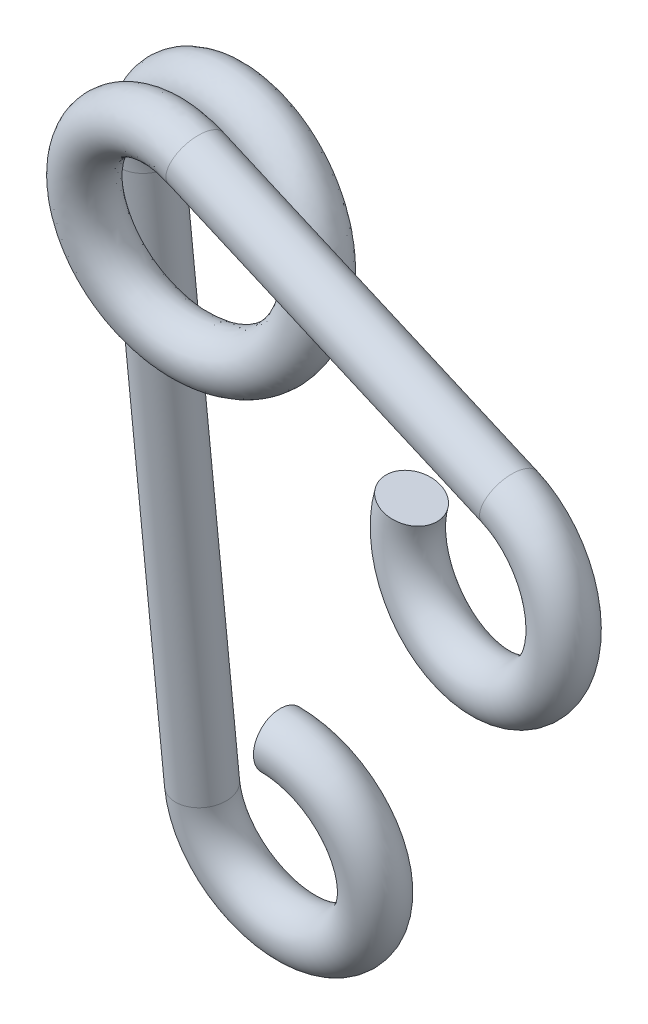
ISO-10303-21;
HEADER;
FILE_DESCRIPTION(('STEP AP214'),'2;1');
FILE_NAME('part.step','',(''),(''),'','','');
FILE_SCHEMA(('AUTOMOTIVE_DESIGN { 1 0 10303 214 1 1 1 1 }'));
ENDSEC;
DATA;
#1=APPLICATION_CONTEXT('core data for automotive mechanical design processes');
#2=APPLICATION_PROTOCOL_DEFINITION('international standard','automotive_design',2000,#1);
#3=PRODUCT_CONTEXT('',#1,'mechanical');
#4=PRODUCT('Part','Part','',(#3));
#5=PRODUCT_RELATED_PRODUCT_CATEGORY('part','',(#4));
#6=PRODUCT_DEFINITION_FORMATION('','',#4);
#7=PRODUCT_DEFINITION_CONTEXT('part definition',#1,'design');
#8=PRODUCT_DEFINITION('design','',#6,#7);
#9=PRODUCT_DEFINITION_SHAPE('','',#8);
#10=(LENGTH_UNIT() NAMED_UNIT(*) SI_UNIT(.MILLI.,.METRE.));
#11=(NAMED_UNIT(*) PLANE_ANGLE_UNIT() SI_UNIT($,.RADIAN.));
#12=(NAMED_UNIT(*) SI_UNIT($,.STERADIAN.) SOLID_ANGLE_UNIT());
#13=UNCERTAINTY_MEASURE_WITH_UNIT(LENGTH_MEASURE(1.E-05),#10,'distance_accuracy_value','');
#14=(GEOMETRIC_REPRESENTATION_CONTEXT(3) GLOBAL_UNCERTAINTY_ASSIGNED_CONTEXT((#13)) GLOBAL_UNIT_ASSIGNED_CONTEXT((#10,
#11,#12)) REPRESENTATION_CONTEXT('',''));
#15=CARTESIAN_POINT('',(0.,0.,0.));
#16=DIRECTION('',(0.,0.,1.));
#17=DIRECTION('',(1.,0.,0.));
#18=AXIS2_PLACEMENT_3D('',#15,#16,#17);
#19=CARTESIAN_POINT('',(-2.925,-0.0743899060389696,0.768407536323998));
#20=CARTESIAN_POINT('',(-2.94917074567298,0.876000205442281,0.857368225275111));
#21=CARTESIAN_POINT('',(-2.41009999823585,1.65908916476,0.946328914226225));
#22=CARTESIAN_POINT('',(-1.87102925079872,2.44217812407772,1.03528960317734));
#23=CARTESIAN_POINT('',(-0.974623713431668,2.75885256498733,1.12425029212845));
#24=CARTESIAN_POINT('',(-0.0782181760646109,3.07552700589693,1.21321098107957));
#25=CARTESIAN_POINT('',(0.833125703661775,2.80482805533932,1.30217167003068));
#26=CARTESIAN_POINT('',(1.74446958338816,2.53412910478171,1.39113235898179));
#27=CARTESIAN_POINT('',(2.32264941885759,1.77945456115097,1.4800930479329));
#28=CARTESIAN_POINT('',(2.90082925432702,1.02478001752022,1.56905373688402));
#29=CARTESIAN_POINT('',(2.925,0.07438990603897,1.65801442583513));
#30=CARTESIAN_POINT('',(2.94917074567298,-0.876000205442281,1.74697511478624));
#31=CARTESIAN_POINT('',(2.41009999823585,-1.65908916476,1.83593580373736));
#32=CARTESIAN_POINT('',(1.87102925079873,-2.44217812407772,1.92489649268847));
#33=CARTESIAN_POINT('',(0.974623713431668,-2.75885256498733,2.01385718163958));
#34=CARTESIAN_POINT('',(0.0782181760646113,-3.07552700589693,2.1028178705907));
#35=CARTESIAN_POINT('',(-0.833125703661775,-2.80482805533932,2.19177855954181));
#36=CARTESIAN_POINT('',(-1.74446958338816,-2.53412910478171,2.28073924849292));
#37=CARTESIAN_POINT('',(-2.32264941885759,-1.77945456115097,2.36969993744404));
#38=CARTESIAN_POINT('',(-2.90082925432702,-1.02478001752022,2.45866062639515));
#39=CARTESIAN_POINT('',(-2.925,-0.0743899060389696,2.54762131534626));
#40=CARTESIAN_POINT('',(-2.94917074567298,0.876000205442281,2.63658200429738));
#41=CARTESIAN_POINT('',(-2.41009999823585,1.65908916476,2.72554269324849));
#42=CARTESIAN_POINT('',(-1.87102925079872,2.44217812407772,2.8145033821996));
#43=CARTESIAN_POINT('',(-0.974623713431668,2.75885256498733,2.90346407115072));
#44=CARTESIAN_POINT('',(-0.126338533199783,3.05852745986901,2.98764922052195));
#45=CARTESIAN_POINT('',(0.743771935802185,2.82983430003129,3.07265935596611));
#46=CARTESIAN_POINT('',(-1.381,-0.0743899060389578,0.768407536323999));
#47=CARTESIAN_POINT('',(-1.40517074567297,0.374324194458686,0.857368225275113));
#48=CARTESIAN_POINT('',(-1.16097775892093,0.751548735220433,0.946328914226226));
#49=CARTESIAN_POINT('',(-0.916784772168877,1.12877327598218,1.03528960317734));
#50=CARTESIAN_POINT('',(-0.497501474116738,1.29042130382761,1.12425029212845));
#51=CARTESIAN_POINT('',(-0.0782181760645984,1.45206933167305,1.21321098107957));
#52=CARTESIAN_POINT('',(0.356003464346867,1.3363967941796,1.30217167003068));
#53=CARTESIAN_POINT('',(0.790225104758333,1.22072425668615,1.39113235898179));
#54=CARTESIAN_POINT('',(1.07352717954268,0.871914131611378,1.48009304793291));
#55=CARTESIAN_POINT('',(1.35682925432703,0.523104006536602,1.56905373688402));
#56=CARTESIAN_POINT('',(1.381,0.074389906038958,1.65801442583513));
#57=CARTESIAN_POINT('',(1.40517074567297,-0.374324194458686,1.74697511478625));
#58=CARTESIAN_POINT('',(1.16097775892093,-0.751548735220433,1.83593580373736));
#59=CARTESIAN_POINT('',(0.916784772168877,-1.12877327598218,1.92489649268847));
#60=CARTESIAN_POINT('',(0.497501474116738,-1.29042130382761,2.01385718163959));
#61=CARTESIAN_POINT('',(0.0782181760645986,-1.45206933167305,2.1028178705907));
#62=CARTESIAN_POINT('',(-0.356003464346867,-1.3363967941796,2.19177855954181));
#63=CARTESIAN_POINT('',(-0.790225104758333,-1.22072425668616,2.28073924849293));
#64=CARTESIAN_POINT('',(-1.07352717954268,-0.871914131611378,2.36969993744404));
#65=CARTESIAN_POINT('',(-1.35682925432703,-0.523104006536602,2.45866062639515));
#66=CARTESIAN_POINT('',(-1.381,-0.0743899060389578,2.54762131534627));
#67=CARTESIAN_POINT('',(-1.40517074567297,0.374324194458686,2.63658200429738));
#68=CARTESIAN_POINT('',(-1.16097775892093,0.751548735220433,2.72554269324849));
#69=CARTESIAN_POINT('',(-0.916784772168877,1.12877327598218,2.81450338219961));
#70=CARTESIAN_POINT('',(-0.497501474116738,1.29042130382761,2.90346407115072));
#71=CARTESIAN_POINT('',(-0.100725915254099,1.44339182968777,2.98764922052195));
#72=CARTESIAN_POINT('',(0.313450290357979,1.34701290773139,3.07265935596612));
#73=CARTESIAN_POINT('',(-1.381,0.0743899060389405,-0.768407536323997));
#74=CARTESIAN_POINT('',(-1.35682925432703,0.523104006536584,-0.679446847372884));
#75=CARTESIAN_POINT('',(-1.07352717954269,0.871914131611364,-0.59048615842177));
#76=CARTESIAN_POINT('',(-0.790225104758348,1.22072425668614,-0.501525469470657));
#77=CARTESIAN_POINT('',(-0.356003464346884,1.3363967941796,-0.412564780519544));
#78=CARTESIAN_POINT('',(0.0782181760645801,1.45206933167305,-0.32360409156843));
#79=CARTESIAN_POINT('',(0.497501474116721,1.29042130382762,-0.234643402617317));
#80=CARTESIAN_POINT('',(0.916784772168862,1.12877327598219,-0.145682713666204));
#81=CARTESIAN_POINT('',(1.16097775892091,0.751548735220447,-0.0567220247150904));
#82=CARTESIAN_POINT('',(1.40517074567297,0.374324194458703,0.0322386642360229));
#83=CARTESIAN_POINT('',(1.381,-0.0743899060389404,0.121199353187136));
#84=CARTESIAN_POINT('',(1.35682925432703,-0.523104006536584,0.21016004213825));
#85=CARTESIAN_POINT('',(1.07352717954269,-0.871914131611364,0.299120731089363));
#86=CARTESIAN_POINT('',(0.790225104758348,-1.22072425668614,0.388081420040476));
#87=CARTESIAN_POINT('',(0.356003464346884,-1.3363967941796,0.47704210899159));
#88=CARTESIAN_POINT('',(-0.0782181760645799,-1.45206933167305,0.566002797942703));
#89=CARTESIAN_POINT('',(-0.497501474116721,-1.29042130382762,0.654963486893816));
#90=CARTESIAN_POINT('',(-0.916784772168862,-1.12877327598219,0.74392417584493));
#91=CARTESIAN_POINT('',(-1.16097775892091,-0.751548735220448,0.832884864796043));
#92=CARTESIAN_POINT('',(-1.40517074567297,-0.374324194458704,0.921845553747156));
#93=CARTESIAN_POINT('',(-1.381,0.0743899060389405,1.01080624269827));
#94=CARTESIAN_POINT('',(-1.35682925432703,0.523104006536584,1.09976693164938));
#95=CARTESIAN_POINT('',(-1.07352717954269,0.871914131611364,1.1887276206005));
#96=CARTESIAN_POINT('',(-0.790225104758348,1.22072425668614,1.27768830955161));
#97=CARTESIAN_POINT('',(-0.356003464346884,1.3363967941796,1.36664899850272));
#98=CARTESIAN_POINT('',(0.0549085248616288,1.44585986108983,1.45083414787396));
#99=CARTESIAN_POINT('',(0.456334932904265,1.30554712175844,1.53584428331812));
#100=CARTESIAN_POINT('',(-2.925,0.0743899060389288,-0.768407536323998));
#101=CARTESIAN_POINT('',(-2.90082925432704,1.02478001752018,-0.679446847372885));
#102=CARTESIAN_POINT('',(-2.32264941885762,1.77945456115093,-0.590486158421771));
#103=CARTESIAN_POINT('',(-1.7444695833882,2.53412910478169,-0.501525469470658));
#104=CARTESIAN_POINT('',(-0.833125703661814,2.80482805533931,-0.412564780519545));
#105=CARTESIAN_POINT('',(0.0782181760645676,3.07552700589693,-0.323604091568432));
#106=CARTESIAN_POINT('',(0.974623713431629,2.75885256498734,-0.234643402617318));
#107=CARTESIAN_POINT('',(1.87102925079869,2.44217812407775,-0.145682713666205));
#108=CARTESIAN_POINT('',(2.41009999823583,1.65908916476004,-0.0567220247150916));
#109=CARTESIAN_POINT('',(2.94917074567296,0.876000205442323,0.0322386642360217));
#110=CARTESIAN_POINT('',(2.925,-0.0743899060389284,0.121199353187135));
#111=CARTESIAN_POINT('',(2.90082925432704,-1.02478001752018,0.210160042138248));
#112=CARTESIAN_POINT('',(2.32264941885762,-1.77945456115093,0.299120731089362));
#113=CARTESIAN_POINT('',(1.7444695833882,-2.53412910478169,0.388081420040475));
#114=CARTESIAN_POINT('',(0.833125703661814,-2.80482805533931,0.477042108991588));
#115=CARTESIAN_POINT('',(-0.0782181760645672,-3.07552700589693,0.566002797942702));
#116=CARTESIAN_POINT('',(-0.974623713431628,-2.75885256498734,0.654963486893815));
#117=CARTESIAN_POINT('',(-1.87102925079869,-2.44217812407775,0.743924175844928));
#118=CARTESIAN_POINT('',(-2.41009999823583,-1.65908916476004,0.832884864796042));
#119=CARTESIAN_POINT('',(-2.94917074567296,-0.876000205442323,0.921845553747155));
#120=CARTESIAN_POINT('',(-2.925,0.0743899060389288,1.01080624269827));
#121=CARTESIAN_POINT('',(-2.90082925432704,1.02478001752018,1.09976693164938));
#122=CARTESIAN_POINT('',(-2.32264941885762,1.77945456115093,1.18872762060049));
#123=CARTESIAN_POINT('',(-1.7444695833882,2.53412910478169,1.27768830955161));
#124=CARTESIAN_POINT('',(-0.833125703661814,2.80482805533931,1.36664899850272));
#125=CARTESIAN_POINT('',(0.0292959069159445,3.06099549127107,1.45083414787396));
#126=CARTESIAN_POINT('',(0.886656578348471,2.78836851405833,1.53584428331812));
#127=CARTESIAN_POINT('',(-4.469,0.074389906038917,-0.768407536324));
#128=CARTESIAN_POINT('',(-4.44482925432704,1.52645602850378,-0.679446847372886));
#129=CARTESIAN_POINT('',(-3.57177165817254,2.6869949906905,-0.590486158421773));
#130=CARTESIAN_POINT('',(-2.69871406201804,3.84753395287723,-0.50152546947066));
#131=CARTESIAN_POINT('',(-1.31024794297674,4.27325931649902,-0.412564780519546));
#132=CARTESIAN_POINT('',(0.0782181760645551,4.69898468012082,-0.323604091568433));
#133=CARTESIAN_POINT('',(1.45174595274654,4.22728382614706,-0.23464340261732));
#134=CARTESIAN_POINT('',(2.82527372942852,3.75558297217331,-0.145682713666206));
#135=CARTESIAN_POINT('',(3.65922223755074,2.56662959429962,-0.056722024715093));
#136=CARTESIAN_POINT('',(4.49317074567296,1.37767621642594,0.0322386642360203));
#137=CARTESIAN_POINT('',(4.469,-0.0743899060389165,0.121199353187134));
#138=CARTESIAN_POINT('',(4.44482925432704,-1.52645602850378,0.210160042138247));
#139=CARTESIAN_POINT('',(3.57177165817254,-2.6869949906905,0.29912073108936));
#140=CARTESIAN_POINT('',(2.69871406201804,-3.84753395287723,0.388081420040474));
#141=CARTESIAN_POINT('',(1.31024794297674,-4.27325931649902,0.477042108991587));
#142=CARTESIAN_POINT('',(-0.0782181760645545,-4.69898468012082,0.5660027979427));
#143=CARTESIAN_POINT('',(-1.45174595274654,-4.22728382614706,0.654963486893814));
#144=CARTESIAN_POINT('',(-2.82527372942852,-3.75558297217331,0.743924175844927));
#145=CARTESIAN_POINT('',(-3.65922223755074,-2.56662959429962,0.83288486479604));
#146=CARTESIAN_POINT('',(-4.49317074567296,-1.37767621642594,0.921845553747153));
#147=CARTESIAN_POINT('',(-4.469,0.074389906038917,1.01080624269827));
#148=CARTESIAN_POINT('',(-4.44482925432704,1.52645602850378,1.09976693164938));
#149=CARTESIAN_POINT('',(-3.57177165817254,2.6869949906905,1.18872762060049));
#150=CARTESIAN_POINT('',(-2.69871406201804,3.84753395287723,1.27768830955161));
#151=CARTESIAN_POINT('',(-1.31024794297674,4.27325931649902,1.36664899850272));
#152=CARTESIAN_POINT('',(0.00368328897026012,4.67613112145232,1.45083414787396));
#153=CARTESIAN_POINT('',(1.31697822379268,4.27118990635822,1.53584428331812));
#154=CARTESIAN_POINT('',(-4.469,-0.0743899060389814,0.768407536323997));
#155=CARTESIAN_POINT('',(-4.49317074567298,1.37767621642588,0.85736822527511));
#156=CARTESIAN_POINT('',(-3.65922223755078,2.56662959429957,0.946328914226224));
#157=CARTESIAN_POINT('',(-2.82527372942857,3.75558297217327,1.03528960317734));
#158=CARTESIAN_POINT('',(-1.4517459527466,4.22728382614704,1.12425029212845));
#159=CARTESIAN_POINT('',(-0.0782181760646234,4.69898468012082,1.21321098107956));
#160=CARTESIAN_POINT('',(1.31024794297668,4.27325931649904,1.30217167003068));
#161=CARTESIAN_POINT('',(2.69871406201799,3.84753395287727,1.39113235898179));
#162=CARTESIAN_POINT('',(3.5717716581725,2.68699499069056,1.4800930479329));
#163=CARTESIAN_POINT('',(4.44482925432702,1.52645602850384,1.56905373688402));
#164=CARTESIAN_POINT('',(4.469,0.0743899060389819,1.65801442583513));
#165=CARTESIAN_POINT('',(4.49317074567298,-1.37767621642588,1.74697511478624));
#166=CARTESIAN_POINT('',(3.65922223755078,-2.56662959429957,1.83593580373736));
#167=CARTESIAN_POINT('',(2.82527372942857,-3.75558297217327,1.92489649268847));
#168=CARTESIAN_POINT('',(1.4517459527466,-4.22728382614704,2.01385718163958));
#169=CARTESIAN_POINT('',(0.078218176064624,-4.69898468012082,2.1028178705907));
#170=CARTESIAN_POINT('',(-1.31024794297668,-4.27325931649904,2.19177855954181));
#171=CARTESIAN_POINT('',(-2.69871406201799,-3.84753395287727,2.28073924849292));
#172=CARTESIAN_POINT('',(-3.5717716581725,-2.68699499069056,2.36969993744404));
#173=CARTESIAN_POINT('',(-4.44482925432702,-1.52645602850384,2.45866062639515));
#174=CARTESIAN_POINT('',(-4.469,-0.0743899060389814,2.54762131534626));
#175=CARTESIAN_POINT('',(-4.49317074567298,1.37767621642588,2.63658200429738));
#176=CARTESIAN_POINT('',(-3.65922223755078,2.56662959429957,2.72554269324849));
#177=CARTESIAN_POINT('',(-2.82527372942857,3.75558297217327,2.8145033821996));
#178=CARTESIAN_POINT('',(-1.4517459527466,4.22728382614704,2.90346407115072));
#179=CARTESIAN_POINT('',(-0.151951151145468,4.67366309005026,2.98764922052195));
#180=CARTESIAN_POINT('',(1.17409358124639,4.31265569233118,3.07265935596611));
#181=CARTESIAN_POINT('',(-2.925,-0.0743899060389696,0.768407536323998));
#182=CARTESIAN_POINT('',(-2.94917074567298,0.876000205442281,0.857368225275111));
#183=CARTESIAN_POINT('',(-2.41009999823585,1.65908916476,0.946328914226225));
#184=CARTESIAN_POINT('',(-1.87102925079872,2.44217812407772,1.03528960317734));
#185=CARTESIAN_POINT('',(-0.974623713431668,2.75885256498733,1.12425029212845));
#186=CARTESIAN_POINT('',(-0.0782181760646109,3.07552700589693,1.21321098107957));
#187=CARTESIAN_POINT('',(0.833125703661775,2.80482805533932,1.30217167003068));
#188=CARTESIAN_POINT('',(1.74446958338816,2.53412910478171,1.39113235898179));
#189=CARTESIAN_POINT('',(2.32264941885759,1.77945456115097,1.4800930479329));
#190=CARTESIAN_POINT('',(2.90082925432702,1.02478001752022,1.56905373688402));
#191=CARTESIAN_POINT('',(2.925,0.07438990603897,1.65801442583513));
#192=CARTESIAN_POINT('',(2.94917074567298,-0.876000205442281,1.74697511478624));
#193=CARTESIAN_POINT('',(2.41009999823585,-1.65908916476,1.83593580373736));
#194=CARTESIAN_POINT('',(1.87102925079873,-2.44217812407772,1.92489649268847));
#195=CARTESIAN_POINT('',(0.974623713431668,-2.75885256498733,2.01385718163958));
#196=CARTESIAN_POINT('',(0.0782181760646113,-3.07552700589693,2.1028178705907));
#197=CARTESIAN_POINT('',(-0.833125703661775,-2.80482805533932,2.19177855954181));
#198=CARTESIAN_POINT('',(-1.74446958338816,-2.53412910478171,2.28073924849292));
#199=CARTESIAN_POINT('',(-2.32264941885759,-1.77945456115097,2.36969993744404));
#200=CARTESIAN_POINT('',(-2.90082925432702,-1.02478001752022,2.45866062639515));
#201=CARTESIAN_POINT('',(-2.925,-0.0743899060389696,2.54762131534626));
#202=CARTESIAN_POINT('',(-2.94917074567298,0.876000205442281,2.63658200429738));
#203=CARTESIAN_POINT('',(-2.41009999823585,1.65908916476,2.72554269324849));
#204=CARTESIAN_POINT('',(-1.87102925079872,2.44217812407772,2.8145033821996));
#205=CARTESIAN_POINT('',(-0.974623713431668,2.75885256498733,2.90346407115072));
#206=CARTESIAN_POINT('',(-0.126338533199783,3.05852745986901,2.98764922052195));
#207=CARTESIAN_POINT('',(0.743771935802185,2.82983430003129,3.07265935596611));
#208=(BOUNDED_SURFACE() B_SPLINE_SURFACE(3,2,((#19,#20,#21,#22,#23,#24,#25,#26,#27,#28,#29,#30,
#31,#32,#33,#34,#35,#36,#37,#38,#39,#40,#41,#42,#43,#44,#45),(#46,#47,#48,#49,#50,#51,#52,#53,
#54,#55,#56,#57,#58,#59,#60,#61,#62,#63,#64,#65,#66,#67,#68,#69,#70,#71,#72),(#73,#74,#75,#76,
#77,#78,#79,#80,#81,#82,#83,#84,#85,#86,#87,#88,#89,#90,#91,#92,#93,#94,#95,#96,#97,#98,#99),
(#100,#101,#102,#103,#104,#105,#106,#107,#108,#109,#110,#111,#112,#113,#114,#115,#116,#117,#118,
#119,#120,#121,#122,#123,#124,#125,#126),(#127,#128,#129,#130,#131,#132,#133,#134,#135,#136,
#137,#138,#139,#140,#141,#142,#143,#144,#145,#146,#147,#148,#149,#150,#151,#152,#153),(#154,
#155,#156,#157,#158,#159,#160,#161,#162,#163,#164,#165,#166,#167,#168,#169,#170,#171,#172,#173,
#174,#175,#176,#177,#178,#179,#180),(#181,#182,#183,#184,#185,#186,#187,#188,#189,#190,#191,
#192,#193,#194,#195,#196,#197,#198,#199,#200,#201,#202,#203,#204,#205,#206,#207)),.UNSPECIFIED.,
.T.,.F.,.F.) B_SPLINE_SURFACE_WITH_KNOTS((4,3,4),(3,2,2,2,2,2,2,2,2,2,2,2,2,3),(0.,0.5,1.),(0.,
0.05,0.1,0.15,0.2,0.25,0.3,0.35,0.4,0.45,0.5,0.55,0.6,0.647440570392035),
.UNSPECIFIED.) GEOMETRIC_REPRESENTATION_ITEM() RATIONAL_B_SPLINE_SURFACE(((1.,0.951056516295154,
1.,0.951056516295154,1.,0.951056516295154,1.,0.951056516295154,1.,0.951056516295154,1.,
0.951056516295154,1.,0.951056516295154,1.,0.951056516295154,1.,0.951056516295154,1.,
0.951056516295154,1.,0.951056516295154,1.,0.951056516295154,1.,0.953561864321377,
0.995245794424217),(0.333333333333333,0.317018838765051,0.333333333333333,0.317018838765051,
0.333333333333333,0.317018838765051,0.333333333333333,0.317018838765051,0.333333333333333,
0.317018838765051,0.333333333333333,0.317018838765051,0.333333333333333,0.317018838765051,
0.333333333333333,0.317018838765051,0.333333333333333,0.317018838765051,0.333333333333333,
0.317018838765051,0.333333333333333,0.317018838765051,0.333333333333333,0.317018838765051,
0.333333333333333,0.317853954773792,0.331748598141406),(0.333333333333333,0.317018838765051,
0.333333333333333,0.317018838765051,0.333333333333333,0.317018838765051,0.333333333333333,
0.317018838765051,0.333333333333333,0.317018838765051,0.333333333333333,0.317018838765051,
0.333333333333333,0.317018838765051,0.333333333333333,0.317018838765051,0.333333333333333,
0.317018838765051,0.333333333333333,0.317018838765051,0.333333333333333,0.317018838765051,
0.333333333333333,0.317018838765051,0.333333333333333,0.317853954773792,0.331748598141406),(1.,
0.951056516295154,1.,0.951056516295154,1.,0.951056516295154,1.,0.951056516295154,1.,
0.951056516295154,1.,0.951056516295154,1.,0.951056516295154,1.,0.951056516295154,1.,
0.951056516295154,1.,0.951056516295154,1.,0.951056516295154,1.,0.951056516295154,1.,
0.953561864321377,0.995245794424217),(0.333333333333333,0.317018838765051,0.333333333333333,
0.317018838765051,0.333333333333333,0.317018838765051,0.333333333333333,0.317018838765051,
0.333333333333333,0.317018838765051,0.333333333333333,0.317018838765051,0.333333333333333,
0.317018838765051,0.333333333333333,0.317018838765051,0.333333333333333,0.317018838765051,
0.333333333333333,0.317018838765051,0.333333333333333,0.317018838765051,0.333333333333333,
0.317018838765051,0.333333333333333,0.317853954773792,0.331748598141406),(0.333333333333333,
0.317018838765051,0.333333333333333,0.317018838765051,0.333333333333333,0.317018838765051,
0.333333333333333,0.317018838765051,0.333333333333333,0.317018838765051,0.333333333333333,
0.317018838765051,0.333333333333333,0.317018838765051,0.333333333333333,0.317018838765051,
0.333333333333333,0.317018838765051,0.333333333333333,0.317018838765051,0.333333333333333,
0.317018838765051,0.333333333333333,0.317018838765051,0.333333333333333,0.317853954773792,
0.331748598141406),(1.,0.951056516295154,1.,0.951056516295154,1.,0.951056516295154,1.,
0.951056516295154,1.,0.951056516295154,1.,0.951056516295154,1.,0.951056516295154,1.,
0.951056516295154,1.,0.951056516295154,1.,0.951056516295154,1.,0.951056516295154,1.,
0.951056516295154,1.,0.953561864321377,0.995245794424217))) REPRESENTATION_ITEM('') SURFACE());
#209=CARTESIAN_POINT('',(-2.925,0.,0.));
#210=DIRECTION('',(0.,-0.995346549642485,-0.0963599819157372));
#211=DIRECTION('',(0.,0.0963599819157372,-0.995346549642485));
#212=AXIS2_PLACEMENT_3D('',#209,#210,#211);
#213=CIRCLE('',#212,0.772);
#214=CARTESIAN_POINT('',(-2.925,0.0743899060389267,-0.768407536323999));
#215=VERTEX_POINT('',#214);
#216=EDGE_CURVE('E49',#215,#215,#213,.T.);
#217=CARTESIAN_POINT('',(0.743771935802185,2.82983430003129,3.07265935596611));
#218=CARTESIAN_POINT('',(1.17409358124639,4.31265569233118,3.07265935596611));
#219=CARTESIAN_POINT('',(1.31697822379268,4.27118990635822,1.53584428331812));
#220=CARTESIAN_POINT('',(0.886656578348471,2.78836851405833,1.53584428331812));
#221=CARTESIAN_POINT('',(0.456334932904265,1.30554712175844,1.53584428331812));
#222=CARTESIAN_POINT('',(0.313450290357979,1.34701290773139,3.07265935596612));
#223=CARTESIAN_POINT('',(0.743771935802185,2.82983430003129,3.07265935596611));
#224=(BOUNDED_CURVE() B_SPLINE_CURVE(3,(#217,#218,#219,#220,#221,#222,#223),.UNSPECIFIED.,.T.,
.F.) B_SPLINE_CURVE_WITH_KNOTS((4,3,4),(0.,0.5,1.),
.UNSPECIFIED.) CURVE() GEOMETRIC_REPRESENTATION_ITEM() RATIONAL_B_SPLINE_CURVE((0.995245794424217,
0.331748598141406,0.331748598141406,0.995245794424217,0.331748598141406,0.331748598141406,0.995245794424217)) REPRESENTATION_ITEM(''));
#225=CARTESIAN_POINT('',(0.743771935802185,2.82983430003129,3.07265935596611));
#226=VERTEX_POINT('',#225);
#227=EDGE_CURVE('E63',#226,#226,#224,.F.);
#228=ORIENTED_EDGE('',*,*,#216,.F.);
#229=EDGE_LOOP('',(#228));
#230=FACE_BOUND('',#229,.T.);
#231=ORIENTED_EDGE('',*,*,#227,.F.);
#232=EDGE_LOOP('',(#231));
#233=FACE_BOUND('',#232,.T.);
#234=ADVANCED_FACE('F37',(#230,#233),#208,.T.);
#235=CARTESIAN_POINT('',(-2.92499999999987,-16.7218220339938,-1.61884769618439));
#236=DIRECTION('',(0.,0.995346549642485,0.0963599819157373));
#237=DIRECTION('',(0.,-0.0963599819157373,0.995346549642485));
#238=AXIS2_PLACEMENT_3D('',#235,#236,#237);
#239=CYLINDRICAL_SURFACE('',#238,0.772);
#240=CARTESIAN_POINT('',(-2.92499999999987,-16.7218220339938,-1.61884769618439));
#241=DIRECTION('',(0.,-0.995346549642485,-0.0963599819157372));
#242=DIRECTION('',(0.,0.0963599819157372,-0.995346549642485));
#243=AXIS2_PLACEMENT_3D('',#240,#241,#242);
#244=CIRCLE('',#243,0.772);
#245=CARTESIAN_POINT('',(-3.69699999999987,-16.7218220339938,-1.6188476961844));
#246=VERTEX_POINT('',#245);
#247=EDGE_CURVE('E11',#246,#246,#244,.T.);
#248=ORIENTED_EDGE('',*,*,#247,.F.);
#249=EDGE_LOOP('',(#248));
#250=FACE_BOUND('',#249,.T.);
#251=ORIENTED_EDGE('',*,*,#216,.T.);
#252=EDGE_LOOP('',(#251));
#253=FACE_BOUND('',#252,.T.);
#254=ADVANCED_FACE('F93',(#250,#253),#239,.T.);
#255=CARTESIAN_POINT('',(10.9191563716206,-0.123109457178254,3.32277682849146));
#256=DIRECTION('',(-0.955907484819794,0.277408785640782,-0.0963599819157373));
#257=DIRECTION('',(-0.278705728914641,-0.960376549417029,0.));
#258=AXIS2_PLACEMENT_3D('',#255,#256,#257);
#259=CYLINDRICAL_SURFACE('',#258,0.772);
#260=CARTESIAN_POINT('',(10.9191563716206,-0.123109457178254,3.32277682849146));
#261=DIRECTION('',(0.955907484819794,-0.277408785640782,0.0963599819157373));
#262=DIRECTION('',(0.278705728914641,0.960376549417029,0.));
#263=AXIS2_PLACEMENT_3D('',#260,#261,#262);
#264=CIRCLE('',#263,0.772);
#265=CARTESIAN_POINT('',(11.1340619000308,0.61837024869388,3.3255080623658));
#266=VERTEX_POINT('',#265);
#267=EDGE_CURVE('E54',#266,#266,#264,.T.);
#268=ORIENTED_EDGE('',*,*,#267,.F.);
#269=EDGE_LOOP('',(#268));
#270=FACE_BOUND('',#269,.T.);
#271=ORIENTED_EDGE('',*,*,#227,.T.);
#272=EDGE_LOOP('',(#271));
#273=FACE_BOUND('',#272,.T.);
#274=ADVANCED_FACE('F72',(#270,#273),#259,.T.);
#275=CARTESIAN_POINT('',(-0.424999999999877,-14.2334556598876,-1.37794774139501));
#276=DIRECTION('',(-1.,0.,0.));
#277=DIRECTION('',(0.,0.0963599819157487,-0.995346549642483));
#278=AXIS2_PLACEMENT_3D('',#275,#276,#277);
#279=PLANE('',#278);
#280=CARTESIAN_POINT('',(-0.424999999999877,-14.2334556598876,-1.37794774139501));
#281=DIRECTION('',(-1.,0.,0.));
#282=DIRECTION('',(0.,0.0963599819157487,-0.995346549642483));
#283=AXIS2_PLACEMENT_3D('',#280,#281,#282);
#284=CIRCLE('',#283,0.772);
#285=CARTESIAN_POINT('',(-0.424999999999879,-13.4650481235636,-1.30355783535607));
#286=VERTEX_POINT('',#285);
#287=EDGE_CURVE('E73',#286,#286,#284,.T.);
#288=ORIENTED_EDGE('',*,*,#287,.T.);
#289=EDGE_LOOP('',(#288));
#290=FACE_BOUND('',#289,.T.);
#291=ADVANCED_FACE('F89',(#290),#279,.T.);
#292=CARTESIAN_POINT('',(-0.42499999999987,-16.7218220339938,-1.61884769618436));
#293=DIRECTION('',(0.,-0.0963599819157372,0.995346549642484));
#294=DIRECTION('',(0.,-0.995346549642485,-0.0963599819157373));
#295=AXIS2_PLACEMENT_3D('',#292,#293,#294);
#296=TOROIDAL_SURFACE('',#295,2.5,0.772);
#297=CARTESIAN_POINT('',(-0.42499999999987,-16.7218220339938,-1.61884769618436));
#298=DIRECTION('',(0.,-0.0963599819157372,0.995346549642484));
#299=DIRECTION('',(0.,-0.995346549642485,-0.0963599819157373));
#300=AXIS2_PLACEMENT_3D('',#297,#298,#299);
#301=CIRCLE('',#300,3.272);
#302=EDGE_CURVE('',#246,#286,#301,.T.);
#303=ORIENTED_EDGE('',*,*,#247,.T.);
#304=ORIENTED_EDGE('',*,*,#287,.F.);
#305=ORIENTED_EDGE('',*,*,#302,.T.);
#306=ORIENTED_EDGE('',*,*,#302,.F.);
#307=EDGE_LOOP('',(#303,#305,#304,#306));
#308=FACE_BOUND('',#307,.T.);
#309=ADVANCED_FACE('F94',(#308),#296,.T.);
#310=CARTESIAN_POINT('',(7.8334500675689,-1.83075234369848,3.07303220441991));
#311=DIRECTION('',(0.278375036800875,0.960465940248876,0.00353786771288131));
#312=DIRECTION('',(-0.955568995832235,0.277323709631785,-0.0998972185810974));
#313=AXIS2_PLACEMENT_3D('',#310,#311,#312);
#314=PLANE('',#313);
#315=CARTESIAN_POINT('',(7.8334500675689,-1.83075234369848,3.07303220441991));
#316=DIRECTION('',(0.278375036800875,0.960465940248876,0.00353786771288131));
#317=DIRECTION('',(-0.955568995832235,0.277323709631785,-0.0998972185810974));
#318=AXIS2_PLACEMENT_3D('',#315,#316,#317);
#319=CIRCLE('',#318,0.772);
#320=CARTESIAN_POINT('',(7.09548948928802,-1.6165927611838,2.99864229838097));
#321=VERTEX_POINT('',#320);
#322=EDGE_CURVE('E76',#321,#321,#319,.T.);
#323=ORIENTED_EDGE('',*,*,#322,.T.);
#324=EDGE_LOOP('',(#323));
#325=FACE_BOUND('',#324,.T.);
#326=ADVANCED_FACE('F83',(#325),#314,.T.);
#327=CARTESIAN_POINT('',(10.2232187796184,-2.52427430780045,3.31393215920926));
#328=DIRECTION('',(0.0935319162190515,-0.0234423392848795,-0.995340262110021));
#329=DIRECTION('',(-0.995613866154905,0.,-0.0935576267339151));
#330=AXIS2_PLACEMENT_3D('',#327,#328,#329);
#331=TOROIDAL_SURFACE('',#330,2.5,0.772);
#332=CARTESIAN_POINT('',(10.2232187796184,-2.52427430780045,3.31393215920926));
#333=DIRECTION('',(0.0935319162190515,-0.0234423392848795,-0.995340262110021));
#334=DIRECTION('',(-0.995613866154905,0.,-0.0935576267339151));
#335=AXIS2_PLACEMENT_3D('',#332,#333,#334);
#336=CIRCLE('',#335,3.272);
#337=EDGE_CURVE('',#266,#321,#336,.T.);
#338=ORIENTED_EDGE('',*,*,#267,.T.);
#339=ORIENTED_EDGE('',*,*,#322,.F.);
#340=ORIENTED_EDGE('',*,*,#337,.T.);
#341=ORIENTED_EDGE('',*,*,#337,.F.);
#342=EDGE_LOOP('',(#338,#340,#339,#341));
#343=FACE_BOUND('',#342,.T.);
#344=ADVANCED_FACE('F85',(#343),#331,.T.);
#345=CLOSED_SHELL('',(#234,#254,#274,#291,#309,#326,#344));
#346=MANIFOLD_SOLID_BREP('B2',#345);
#347=ADVANCED_BREP_SHAPE_REPRESENTATION('',(#18,#346),#14);
#348=SHAPE_DEFINITION_REPRESENTATION(#9,#347);
ENDSEC;
END-ISO-10303-21;
